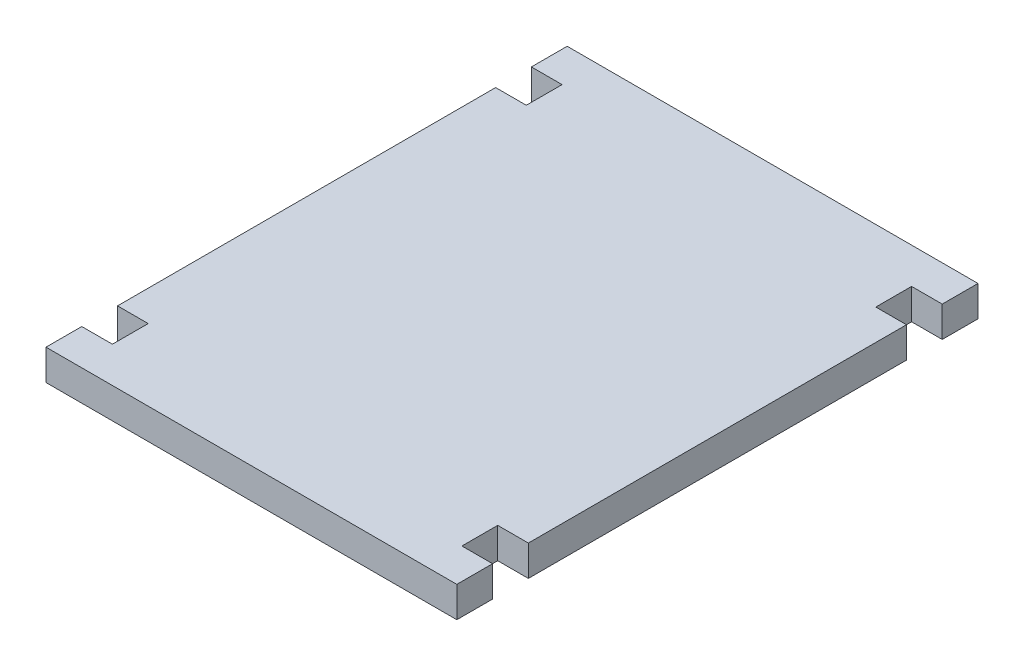
ISO-10303-21;
HEADER;
FILE_DESCRIPTION(('STEP AP214'),'2;1');
FILE_NAME('part.step','',(''),(''),'','','');
FILE_SCHEMA(('AUTOMOTIVE_DESIGN { 1 0 10303 214 1 1 1 1 }'));
ENDSEC;
DATA;
#1=APPLICATION_CONTEXT('core data for automotive mechanical design processes');
#2=APPLICATION_PROTOCOL_DEFINITION('international standard','automotive_design',2000,#1);
#3=PRODUCT_CONTEXT('',#1,'mechanical');
#4=PRODUCT('Part','Part','',(#3));
#5=PRODUCT_RELATED_PRODUCT_CATEGORY('part','',(#4));
#6=PRODUCT_DEFINITION_FORMATION('','',#4);
#7=PRODUCT_DEFINITION_CONTEXT('part definition',#1,'design');
#8=PRODUCT_DEFINITION('design','',#6,#7);
#9=PRODUCT_DEFINITION_SHAPE('','',#8);
#10=(LENGTH_UNIT() NAMED_UNIT(*) SI_UNIT(.MILLI.,.METRE.));
#11=(NAMED_UNIT(*) PLANE_ANGLE_UNIT() SI_UNIT($,.RADIAN.));
#12=(NAMED_UNIT(*) SI_UNIT($,.STERADIAN.) SOLID_ANGLE_UNIT());
#13=UNCERTAINTY_MEASURE_WITH_UNIT(LENGTH_MEASURE(1.E-05),#10,'distance_accuracy_value','');
#14=(GEOMETRIC_REPRESENTATION_CONTEXT(3) GLOBAL_UNCERTAINTY_ASSIGNED_CONTEXT((#13)) GLOBAL_UNIT_ASSIGNED_CONTEXT((#10,
#11,#12)) REPRESENTATION_CONTEXT('',''));
#15=CARTESIAN_POINT('',(0.,0.,0.));
#16=DIRECTION('',(0.,0.,1.));
#17=DIRECTION('',(1.,0.,0.));
#18=AXIS2_PLACEMENT_3D('',#15,#16,#17);
#19=CARTESIAN_POINT('',(33.5,5.,-42.5));
#20=DIRECTION('',(-1.,0.,0.));
#21=DIRECTION('',(0.,0.,1.));
#22=AXIS2_PLACEMENT_3D('',#19,#20,#21);
#23=PLANE('',#22);
#24=DIRECTION('',(0.,0.,-1.));
#25=VECTOR('',#24,1.);
#26=CARTESIAN_POINT('',(33.5,5.,-42.5));
#27=LINE('',#26,#25);
#28=CARTESIAN_POINT('',(33.5,5.,30.833334));
#29=VERTEX_POINT('',#28);
#30=CARTESIAN_POINT('',(33.5,5.,-30.833334));
#31=VERTEX_POINT('',#30);
#32=EDGE_CURVE('E287',#29,#31,#27,.T.);
#33=ORIENTED_EDGE('',*,*,#32,.F.);
#34=DIRECTION('',(0.,1.,0.));
#35=VECTOR('',#34,1.);
#36=CARTESIAN_POINT('',(33.5,0.,30.833334));
#37=LINE('',#36,#35);
#38=CARTESIAN_POINT('',(33.5,0.,30.833334));
#39=VERTEX_POINT('',#38);
#40=EDGE_CURVE('E198',#39,#29,#37,.T.);
#41=ORIENTED_EDGE('',*,*,#40,.F.);
#42=DIRECTION('',(0.,0.,-1.));
#43=VECTOR('',#42,1.);
#44=CARTESIAN_POINT('',(33.5,0.,-42.5));
#45=LINE('',#44,#43);
#46=CARTESIAN_POINT('',(33.5,0.,-30.833334));
#47=VERTEX_POINT('',#46);
#48=EDGE_CURVE('E302',#39,#47,#45,.T.);
#49=ORIENTED_EDGE('',*,*,#48,.T.);
#50=DIRECTION('',(0.,1.,0.));
#51=VECTOR('',#50,1.);
#52=CARTESIAN_POINT('',(33.5,0.,-30.833334));
#53=LINE('',#52,#51);
#54=EDGE_CURVE('E344',#47,#31,#53,.T.);
#55=ORIENTED_EDGE('',*,*,#54,.T.);
#56=EDGE_LOOP('',(#33,#41,#49,#55));
#57=FACE_BOUND('',#56,.T.);
#58=ADVANCED_FACE('F38',(#57),#23,.F.);
#59=CARTESIAN_POINT('',(33.5,5.,-36.666667));
#60=VERTEX_POINT('',#59);
#61=CARTESIAN_POINT('',(33.5,5.,-42.5));
#62=VERTEX_POINT('',#61);
#63=EDGE_CURVE('E288',#60,#62,#27,.T.);
#64=ORIENTED_EDGE('',*,*,#63,.F.);
#65=DIRECTION('',(0.,1.,0.));
#66=VECTOR('',#65,1.);
#67=CARTESIAN_POINT('',(33.5,0.,-36.666667));
#68=LINE('',#67,#66);
#69=CARTESIAN_POINT('',(33.5,0.,-36.666667));
#70=VERTEX_POINT('',#69);
#71=EDGE_CURVE('E185',#70,#60,#68,.T.);
#72=ORIENTED_EDGE('',*,*,#71,.F.);
#73=CARTESIAN_POINT('',(33.5,0.,-42.5));
#74=VERTEX_POINT('',#73);
#75=EDGE_CURVE('E276',#70,#74,#45,.T.);
#76=ORIENTED_EDGE('',*,*,#75,.T.);
#77=DIRECTION('',(0.,-1.,0.));
#78=VECTOR('',#77,1.);
#79=CARTESIAN_POINT('',(33.5,5.,-42.5));
#80=LINE('',#79,#78);
#81=EDGE_CURVE('E11',#62,#74,#80,.T.);
#82=ORIENTED_EDGE('',*,*,#81,.F.);
#83=EDGE_LOOP('',(#64,#72,#76,#82));
#84=FACE_BOUND('',#83,.T.);
#85=ADVANCED_FACE('F337',(#84),#23,.F.);
#86=CARTESIAN_POINT('',(-33.5,5.,-42.5));
#87=DIRECTION('',(1.,0.,0.));
#88=DIRECTION('',(0.,0.,-1.));
#89=AXIS2_PLACEMENT_3D('',#86,#87,#88);
#90=PLANE('',#89);
#91=DIRECTION('',(0.,0.,1.));
#92=VECTOR('',#91,1.);
#93=CARTESIAN_POINT('',(-33.5,5.,-42.5));
#94=LINE('',#93,#92);
#95=CARTESIAN_POINT('',(-33.5,5.,-30.833334));
#96=VERTEX_POINT('',#95);
#97=CARTESIAN_POINT('',(-33.5,5.,30.833334));
#98=VERTEX_POINT('',#97);
#99=EDGE_CURVE('E295',#96,#98,#94,.T.);
#100=ORIENTED_EDGE('',*,*,#99,.F.);
#101=DIRECTION('',(0.,1.,0.));
#102=VECTOR('',#101,1.);
#103=CARTESIAN_POINT('',(-33.5,0.,-30.833334));
#104=LINE('',#103,#102);
#105=CARTESIAN_POINT('',(-33.5,0.,-30.833334));
#106=VERTEX_POINT('',#105);
#107=EDGE_CURVE('E218',#106,#96,#104,.T.);
#108=ORIENTED_EDGE('',*,*,#107,.F.);
#109=DIRECTION('',(0.,0.,1.));
#110=VECTOR('',#109,1.);
#111=CARTESIAN_POINT('',(-33.5,0.,-42.5));
#112=LINE('',#111,#110);
#113=CARTESIAN_POINT('',(-33.5,0.,30.833334));
#114=VERTEX_POINT('',#113);
#115=EDGE_CURVE('E309',#106,#114,#112,.T.);
#116=ORIENTED_EDGE('',*,*,#115,.T.);
#117=DIRECTION('',(0.,1.,0.));
#118=VECTOR('',#117,1.);
#119=CARTESIAN_POINT('',(-33.5,0.,30.833334));
#120=LINE('',#119,#118);
#121=EDGE_CURVE('E279',#114,#98,#120,.T.);
#122=ORIENTED_EDGE('',*,*,#121,.T.);
#123=EDGE_LOOP('',(#100,#108,#116,#122));
#124=FACE_BOUND('',#123,.T.);
#125=ADVANCED_FACE('F367',(#124),#90,.F.);
#126=CARTESIAN_POINT('',(-33.5,5.,36.666667));
#127=VERTEX_POINT('',#126);
#128=CARTESIAN_POINT('',(-33.5,5.,42.5));
#129=VERTEX_POINT('',#128);
#130=EDGE_CURVE('E290',#127,#129,#94,.T.);
#131=ORIENTED_EDGE('',*,*,#130,.F.);
#132=DIRECTION('',(0.,1.,0.));
#133=VECTOR('',#132,1.);
#134=CARTESIAN_POINT('',(-33.5,0.,36.666667));
#135=LINE('',#134,#133);
#136=CARTESIAN_POINT('',(-33.5,0.,36.666667));
#137=VERTEX_POINT('',#136);
#138=EDGE_CURVE('E277',#137,#127,#135,.T.);
#139=ORIENTED_EDGE('',*,*,#138,.F.);
#140=CARTESIAN_POINT('',(-33.5,0.,42.5));
#141=VERTEX_POINT('',#140);
#142=EDGE_CURVE('E304',#137,#141,#112,.T.);
#143=ORIENTED_EDGE('',*,*,#142,.T.);
#144=DIRECTION('',(0.,-1.,0.));
#145=VECTOR('',#144,1.);
#146=CARTESIAN_POINT('',(-33.5,5.,42.5));
#147=LINE('',#146,#145);
#148=EDGE_CURVE('E313',#129,#141,#147,.T.);
#149=ORIENTED_EDGE('',*,*,#148,.F.);
#150=EDGE_LOOP('',(#131,#139,#143,#149));
#151=FACE_BOUND('',#150,.T.);
#152=ADVANCED_FACE('F369',(#151),#90,.F.);
#153=CARTESIAN_POINT('',(33.5,0.,42.5));
#154=VERTEX_POINT('',#153);
#155=CARTESIAN_POINT('',(33.5,0.,36.666667));
#156=VERTEX_POINT('',#155);
#157=EDGE_CURVE('E298',#154,#156,#45,.T.);
#158=ORIENTED_EDGE('',*,*,#157,.T.);
#159=DIRECTION('',(0.,1.,0.));
#160=VECTOR('',#159,1.);
#161=CARTESIAN_POINT('',(33.5,0.,36.666667));
#162=LINE('',#161,#160);
#163=CARTESIAN_POINT('',(33.5,5.,36.666667));
#164=VERTEX_POINT('',#163);
#165=EDGE_CURVE('E200',#156,#164,#162,.T.);
#166=ORIENTED_EDGE('',*,*,#165,.T.);
#167=CARTESIAN_POINT('',(33.5,5.,42.5));
#168=VERTEX_POINT('',#167);
#169=EDGE_CURVE('E283',#168,#164,#27,.T.);
#170=ORIENTED_EDGE('',*,*,#169,.F.);
#171=DIRECTION('',(0.,-1.,0.));
#172=VECTOR('',#171,1.);
#173=CARTESIAN_POINT('',(33.5,5.,42.5));
#174=LINE('',#173,#172);
#175=EDGE_CURVE('E297',#168,#154,#174,.T.);
#176=ORIENTED_EDGE('',*,*,#175,.T.);
#177=EDGE_LOOP('',(#158,#166,#170,#176));
#178=FACE_BOUND('',#177,.T.);
#179=ADVANCED_FACE('F40',(#178),#23,.F.);
#180=CARTESIAN_POINT('',(-33.5,5.,-42.5));
#181=DIRECTION('',(0.,0.,1.));
#182=DIRECTION('',(1.,0.,0.));
#183=AXIS2_PLACEMENT_3D('',#180,#181,#182);
#184=PLANE('',#183);
#185=DIRECTION('',(-1.,0.,0.));
#186=VECTOR('',#185,1.);
#187=CARTESIAN_POINT('',(-33.5,0.,-42.5));
#188=LINE('',#187,#186);
#189=CARTESIAN_POINT('',(-33.5,0.,-42.5));
#190=VERTEX_POINT('',#189);
#191=EDGE_CURVE('E301',#74,#190,#188,.T.);
#192=ORIENTED_EDGE('',*,*,#191,.T.);
#193=DIRECTION('',(0.,-1.,0.));
#194=VECTOR('',#193,1.);
#195=CARTESIAN_POINT('',(-33.5,5.,-42.5));
#196=LINE('',#195,#194);
#197=CARTESIAN_POINT('',(-33.5,5.,-42.5));
#198=VERTEX_POINT('',#197);
#199=EDGE_CURVE('E46',#198,#190,#196,.T.);
#200=ORIENTED_EDGE('',*,*,#199,.F.);
#201=DIRECTION('',(-1.,0.,0.));
#202=VECTOR('',#201,1.);
#203=CARTESIAN_POINT('',(-33.5,5.,-42.5));
#204=LINE('',#203,#202);
#205=EDGE_CURVE('E286',#62,#198,#204,.T.);
#206=ORIENTED_EDGE('',*,*,#205,.F.);
#207=ORIENTED_EDGE('',*,*,#81,.T.);
#208=EDGE_LOOP('',(#192,#200,#206,#207));
#209=FACE_BOUND('',#208,.T.);
#210=ADVANCED_FACE('F335',(#209),#184,.F.);
#211=CARTESIAN_POINT('',(-33.5,0.,-36.666667));
#212=VERTEX_POINT('',#211);
#213=EDGE_CURVE('E305',#190,#212,#112,.T.);
#214=ORIENTED_EDGE('',*,*,#213,.T.);
#215=DIRECTION('',(0.,1.,0.));
#216=VECTOR('',#215,1.);
#217=CARTESIAN_POINT('',(-33.5,0.,-36.666667));
#218=LINE('',#217,#216);
#219=CARTESIAN_POINT('',(-33.5,5.,-36.666667));
#220=VERTEX_POINT('',#219);
#221=EDGE_CURVE('E215',#212,#220,#218,.T.);
#222=ORIENTED_EDGE('',*,*,#221,.T.);
#223=EDGE_CURVE('E291',#198,#220,#94,.T.);
#224=ORIENTED_EDGE('',*,*,#223,.F.);
#225=ORIENTED_EDGE('',*,*,#199,.T.);
#226=EDGE_LOOP('',(#214,#222,#224,#225));
#227=FACE_BOUND('',#226,.T.);
#228=ADVANCED_FACE('F320',(#227),#90,.F.);
#229=CARTESIAN_POINT('',(-33.5,5.,42.5));
#230=DIRECTION('',(0.,0.,-1.));
#231=DIRECTION('',(-1.,0.,0.));
#232=AXIS2_PLACEMENT_3D('',#229,#230,#231);
#233=PLANE('',#232);
#234=DIRECTION('',(1.,0.,0.));
#235=VECTOR('',#234,1.);
#236=CARTESIAN_POINT('',(-33.5,0.,42.5));
#237=LINE('',#236,#235);
#238=EDGE_CURVE('E308',#141,#154,#237,.T.);
#239=ORIENTED_EDGE('',*,*,#238,.T.);
#240=ORIENTED_EDGE('',*,*,#175,.F.);
#241=DIRECTION('',(1.,0.,0.));
#242=VECTOR('',#241,1.);
#243=CARTESIAN_POINT('',(-33.5,5.,42.5));
#244=LINE('',#243,#242);
#245=EDGE_CURVE('E294',#129,#168,#244,.T.);
#246=ORIENTED_EDGE('',*,*,#245,.F.);
#247=ORIENTED_EDGE('',*,*,#148,.T.);
#248=EDGE_LOOP('',(#239,#240,#246,#247));
#249=FACE_BOUND('',#248,.T.);
#250=ADVANCED_FACE('F393',(#249),#233,.F.);
#251=CARTESIAN_POINT('',(0.,5.,0.));
#252=DIRECTION('',(0.,1.,0.));
#253=DIRECTION('',(0.,0.,1.));
#254=AXIS2_PLACEMENT_3D('',#251,#252,#253);
#255=PLANE('',#254);
#256=DIRECTION('',(1.,0.,0.));
#257=VECTOR('',#256,1.);
#258=CARTESIAN_POINT('',(-28.5,5.,-30.833334));
#259=LINE('',#258,#257);
#260=CARTESIAN_POINT('',(-28.5,5.,-30.833334));
#261=VERTEX_POINT('',#260);
#262=EDGE_CURVE('E227',#96,#261,#259,.T.);
#263=ORIENTED_EDGE('',*,*,#262,.F.);
#264=ORIENTED_EDGE('',*,*,#99,.T.);
#265=DIRECTION('',(-1.,0.,0.));
#266=VECTOR('',#265,1.);
#267=CARTESIAN_POINT('',(-28.5,5.,30.833334));
#268=LINE('',#267,#266);
#269=CARTESIAN_POINT('',(-28.5,5.,30.833334));
#270=VERTEX_POINT('',#269);
#271=EDGE_CURVE('E270',#270,#98,#268,.T.);
#272=ORIENTED_EDGE('',*,*,#271,.F.);
#273=DIRECTION('',(0.,0.,-1.));
#274=VECTOR('',#273,1.);
#275=CARTESIAN_POINT('',(-28.5,5.,30.833334));
#276=LINE('',#275,#274);
#277=CARTESIAN_POINT('',(-28.5,5.,36.666667));
#278=VERTEX_POINT('',#277);
#279=EDGE_CURVE('E230',#278,#270,#276,.T.);
#280=ORIENTED_EDGE('',*,*,#279,.F.);
#281=DIRECTION('',(1.,0.,0.));
#282=VECTOR('',#281,1.);
#283=CARTESIAN_POINT('',(-28.5,5.,36.666667));
#284=LINE('',#283,#282);
#285=EDGE_CURVE('E261',#127,#278,#284,.T.);
#286=ORIENTED_EDGE('',*,*,#285,.F.);
#287=ORIENTED_EDGE('',*,*,#130,.T.);
#288=ORIENTED_EDGE('',*,*,#245,.T.);
#289=ORIENTED_EDGE('',*,*,#169,.T.);
#290=DIRECTION('',(1.,0.,0.));
#291=VECTOR('',#290,1.);
#292=CARTESIAN_POINT('',(28.5,5.,36.666667));
#293=LINE('',#292,#291);
#294=CARTESIAN_POINT('',(28.5,5.,36.666667));
#295=VERTEX_POINT('',#294);
#296=EDGE_CURVE('E243',#295,#164,#293,.T.);
#297=ORIENTED_EDGE('',*,*,#296,.F.);
#298=DIRECTION('',(0.,0.,1.));
#299=VECTOR('',#298,1.);
#300=CARTESIAN_POINT('',(28.5,5.,30.833334));
#301=LINE('',#300,#299);
#302=CARTESIAN_POINT('',(28.5,5.,30.833334));
#303=VERTEX_POINT('',#302);
#304=EDGE_CURVE('E245',#303,#295,#301,.T.);
#305=ORIENTED_EDGE('',*,*,#304,.F.);
#306=DIRECTION('',(-1.,0.,0.));
#307=VECTOR('',#306,1.);
#308=CARTESIAN_POINT('',(28.5,5.,30.833334));
#309=LINE('',#308,#307);
#310=EDGE_CURVE('E220',#29,#303,#309,.T.);
#311=ORIENTED_EDGE('',*,*,#310,.F.);
#312=ORIENTED_EDGE('',*,*,#32,.T.);
#313=DIRECTION('',(1.,0.,0.));
#314=VECTOR('',#313,1.);
#315=CARTESIAN_POINT('',(28.5,5.,-30.833334));
#316=LINE('',#315,#314);
#317=CARTESIAN_POINT('',(28.5,5.,-30.833334));
#318=VERTEX_POINT('',#317);
#319=EDGE_CURVE('E193',#318,#31,#316,.T.);
#320=ORIENTED_EDGE('',*,*,#319,.F.);
#321=DIRECTION('',(0.,0.,1.));
#322=VECTOR('',#321,1.);
#323=CARTESIAN_POINT('',(28.5,5.,-30.833334));
#324=LINE('',#323,#322);
#325=CARTESIAN_POINT('',(28.5,5.,-36.666667));
#326=VERTEX_POINT('',#325);
#327=EDGE_CURVE('E179',#326,#318,#324,.T.);
#328=ORIENTED_EDGE('',*,*,#327,.F.);
#329=DIRECTION('',(-1.,0.,0.));
#330=VECTOR('',#329,1.);
#331=CARTESIAN_POINT('',(28.5,5.,-36.666667));
#332=LINE('',#331,#330);
#333=EDGE_CURVE('E188',#60,#326,#332,.T.);
#334=ORIENTED_EDGE('',*,*,#333,.F.);
#335=ORIENTED_EDGE('',*,*,#63,.T.);
#336=ORIENTED_EDGE('',*,*,#205,.T.);
#337=ORIENTED_EDGE('',*,*,#223,.T.);
#338=DIRECTION('',(-1.,0.,0.));
#339=VECTOR('',#338,1.);
#340=CARTESIAN_POINT('',(-28.5,5.,-36.666667));
#341=LINE('',#340,#339);
#342=CARTESIAN_POINT('',(-28.5,5.,-36.666667));
#343=VERTEX_POINT('',#342);
#344=EDGE_CURVE('E221',#343,#220,#341,.T.);
#345=ORIENTED_EDGE('',*,*,#344,.F.);
#346=DIRECTION('',(0.,0.,-1.));
#347=VECTOR('',#346,1.);
#348=CARTESIAN_POINT('',(-28.5,5.,-30.833334));
#349=LINE('',#348,#347);
#350=EDGE_CURVE('E223',#261,#343,#349,.T.);
#351=ORIENTED_EDGE('',*,*,#350,.F.);
#352=EDGE_LOOP('',(#263,#264,#272,#280,#286,#287,#288,#289,#297,#305,#311,#312,#320,#328,#334,
#335,#336,#337,#345,#351));
#353=FACE_BOUND('',#352,.T.);
#354=ADVANCED_FACE('F196',(#353),#255,.T.);
#355=CARTESIAN_POINT('',(0.,0.,0.));
#356=DIRECTION('',(0.,1.,0.));
#357=DIRECTION('',(0.,0.,1.));
#358=AXIS2_PLACEMENT_3D('',#355,#356,#357);
#359=PLANE('',#358);
#360=ORIENTED_EDGE('',*,*,#115,.F.);
#361=DIRECTION('',(1.,0.,0.));
#362=VECTOR('',#361,1.);
#363=CARTESIAN_POINT('',(-28.5,0.,-30.833334));
#364=LINE('',#363,#362);
#365=CARTESIAN_POINT('',(-28.5,0.,-30.833334));
#366=VERTEX_POINT('',#365);
#367=EDGE_CURVE('E224',#106,#366,#364,.T.);
#368=ORIENTED_EDGE('',*,*,#367,.T.);
#369=DIRECTION('',(0.,0.,-1.));
#370=VECTOR('',#369,1.);
#371=CARTESIAN_POINT('',(-28.5,0.,-30.833334));
#372=LINE('',#371,#370);
#373=CARTESIAN_POINT('',(-28.5,0.,-36.666667));
#374=VERTEX_POINT('',#373);
#375=EDGE_CURVE('E232',#366,#374,#372,.T.);
#376=ORIENTED_EDGE('',*,*,#375,.T.);
#377=DIRECTION('',(-1.,0.,0.));
#378=VECTOR('',#377,1.);
#379=CARTESIAN_POINT('',(-28.5,0.,-36.666667));
#380=LINE('',#379,#378);
#381=EDGE_CURVE('E53',#374,#212,#380,.T.);
#382=ORIENTED_EDGE('',*,*,#381,.T.);
#383=ORIENTED_EDGE('',*,*,#213,.F.);
#384=ORIENTED_EDGE('',*,*,#191,.F.);
#385=ORIENTED_EDGE('',*,*,#75,.F.);
#386=DIRECTION('',(-1.,0.,0.));
#387=VECTOR('',#386,1.);
#388=CARTESIAN_POINT('',(28.5,0.,-36.666667));
#389=LINE('',#388,#387);
#390=CARTESIAN_POINT('',(28.5,0.,-36.666667));
#391=VERTEX_POINT('',#390);
#392=EDGE_CURVE('E204',#70,#391,#389,.T.);
#393=ORIENTED_EDGE('',*,*,#392,.T.);
#394=DIRECTION('',(0.,0.,1.));
#395=VECTOR('',#394,1.);
#396=CARTESIAN_POINT('',(28.5,0.,-30.833334));
#397=LINE('',#396,#395);
#398=CARTESIAN_POINT('',(28.5,0.,-30.833334));
#399=VERTEX_POINT('',#398);
#400=EDGE_CURVE('E182',#391,#399,#397,.T.);
#401=ORIENTED_EDGE('',*,*,#400,.T.);
#402=DIRECTION('',(1.,0.,0.));
#403=VECTOR('',#402,1.);
#404=CARTESIAN_POINT('',(28.5,0.,-30.833334));
#405=LINE('',#404,#403);
#406=EDGE_CURVE('E206',#399,#47,#405,.T.);
#407=ORIENTED_EDGE('',*,*,#406,.T.);
#408=ORIENTED_EDGE('',*,*,#48,.F.);
#409=DIRECTION('',(-1.,0.,0.));
#410=VECTOR('',#409,1.);
#411=CARTESIAN_POINT('',(28.5,0.,30.833334));
#412=LINE('',#411,#410);
#413=CARTESIAN_POINT('',(28.5,0.,30.833334));
#414=VERTEX_POINT('',#413);
#415=EDGE_CURVE('E246',#39,#414,#412,.T.);
#416=ORIENTED_EDGE('',*,*,#415,.T.);
#417=DIRECTION('',(0.,0.,1.));
#418=VECTOR('',#417,1.);
#419=CARTESIAN_POINT('',(28.5,0.,30.833334));
#420=LINE('',#419,#418);
#421=CARTESIAN_POINT('',(28.5,0.,36.666667));
#422=VERTEX_POINT('',#421);
#423=EDGE_CURVE('E252',#414,#422,#420,.T.);
#424=ORIENTED_EDGE('',*,*,#423,.T.);
#425=DIRECTION('',(1.,0.,0.));
#426=VECTOR('',#425,1.);
#427=CARTESIAN_POINT('',(28.5,0.,36.666667));
#428=LINE('',#427,#426);
#429=EDGE_CURVE('E61',#422,#156,#428,.T.);
#430=ORIENTED_EDGE('',*,*,#429,.T.);
#431=ORIENTED_EDGE('',*,*,#157,.F.);
#432=ORIENTED_EDGE('',*,*,#238,.F.);
#433=ORIENTED_EDGE('',*,*,#142,.F.);
#434=DIRECTION('',(1.,0.,0.));
#435=VECTOR('',#434,1.);
#436=CARTESIAN_POINT('',(-28.5,0.,36.666667));
#437=LINE('',#436,#435);
#438=CARTESIAN_POINT('',(-28.5,0.,36.666667));
#439=VERTEX_POINT('',#438);
#440=EDGE_CURVE('E264',#137,#439,#437,.T.);
#441=ORIENTED_EDGE('',*,*,#440,.T.);
#442=DIRECTION('',(0.,0.,-1.));
#443=VECTOR('',#442,1.);
#444=CARTESIAN_POINT('',(-28.5,0.,30.833334));
#445=LINE('',#444,#443);
#446=CARTESIAN_POINT('',(-28.5,0.,30.833334));
#447=VERTEX_POINT('',#446);
#448=EDGE_CURVE('E257',#439,#447,#445,.T.);
#449=ORIENTED_EDGE('',*,*,#448,.T.);
#450=DIRECTION('',(-1.,0.,0.));
#451=VECTOR('',#450,1.);
#452=CARTESIAN_POINT('',(-28.5,0.,30.833334));
#453=LINE('',#452,#451);
#454=EDGE_CURVE('E260',#447,#114,#453,.T.);
#455=ORIENTED_EDGE('',*,*,#454,.T.);
#456=EDGE_LOOP('',(#360,#368,#376,#382,#383,#384,#385,#393,#401,#407,#408,#416,#424,#430,#431,
#432,#433,#441,#449,#455));
#457=FACE_BOUND('',#456,.T.);
#458=ADVANCED_FACE('F326',(#457),#359,.F.);
#459=CARTESIAN_POINT('',(-28.5,0.,30.833334));
#460=DIRECTION('',(1.,0.,0.));
#461=DIRECTION('',(0.,0.,-1.));
#462=AXIS2_PLACEMENT_3D('',#459,#460,#461);
#463=PLANE('',#462);
#464=ORIENTED_EDGE('',*,*,#279,.T.);
#465=DIRECTION('',(0.,1.,0.));
#466=VECTOR('',#465,1.);
#467=CARTESIAN_POINT('',(-28.5,0.,30.833334));
#468=LINE('',#467,#466);
#469=EDGE_CURVE('E267',#447,#270,#468,.T.);
#470=ORIENTED_EDGE('',*,*,#469,.F.);
#471=ORIENTED_EDGE('',*,*,#448,.F.);
#472=DIRECTION('',(0.,1.,0.));
#473=VECTOR('',#472,1.);
#474=CARTESIAN_POINT('',(-28.5,0.,36.666667));
#475=LINE('',#474,#473);
#476=EDGE_CURVE('E274',#439,#278,#475,.T.);
#477=ORIENTED_EDGE('',*,*,#476,.T.);
#478=EDGE_LOOP('',(#464,#470,#471,#477));
#479=FACE_BOUND('',#478,.T.);
#480=ADVANCED_FACE('F424',(#479),#463,.F.);
#481=CARTESIAN_POINT('',(-28.5,0.,36.666667));
#482=DIRECTION('',(0.,0.,1.));
#483=DIRECTION('',(1.,0.,0.));
#484=AXIS2_PLACEMENT_3D('',#481,#482,#483);
#485=PLANE('',#484);
#486=ORIENTED_EDGE('',*,*,#285,.T.);
#487=ORIENTED_EDGE('',*,*,#476,.F.);
#488=ORIENTED_EDGE('',*,*,#440,.F.);
#489=ORIENTED_EDGE('',*,*,#138,.T.);
#490=EDGE_LOOP('',(#486,#487,#488,#489));
#491=FACE_BOUND('',#490,.T.);
#492=ADVANCED_FACE('F421',(#491),#485,.F.);
#493=CARTESIAN_POINT('',(-28.5,0.,30.833334));
#494=DIRECTION('',(0.,0.,-1.));
#495=DIRECTION('',(-1.,0.,0.));
#496=AXIS2_PLACEMENT_3D('',#493,#494,#495);
#497=PLANE('',#496);
#498=ORIENTED_EDGE('',*,*,#271,.T.);
#499=ORIENTED_EDGE('',*,*,#121,.F.);
#500=ORIENTED_EDGE('',*,*,#454,.F.);
#501=ORIENTED_EDGE('',*,*,#469,.T.);
#502=EDGE_LOOP('',(#498,#499,#500,#501));
#503=FACE_BOUND('',#502,.T.);
#504=ADVANCED_FACE('F403',(#503),#497,.F.);
#505=CARTESIAN_POINT('',(28.5,0.,-30.833334));
#506=DIRECTION('',(-1.,0.,0.));
#507=DIRECTION('',(0.,0.,1.));
#508=AXIS2_PLACEMENT_3D('',#505,#506,#507);
#509=PLANE('',#508);
#510=ORIENTED_EDGE('',*,*,#327,.T.);
#511=DIRECTION('',(0.,1.,0.));
#512=VECTOR('',#511,1.);
#513=CARTESIAN_POINT('',(28.5,0.,-30.833334));
#514=LINE('',#513,#512);
#515=EDGE_CURVE('E207',#399,#318,#514,.T.);
#516=ORIENTED_EDGE('',*,*,#515,.F.);
#517=ORIENTED_EDGE('',*,*,#400,.F.);
#518=DIRECTION('',(0.,1.,0.));
#519=VECTOR('',#518,1.);
#520=CARTESIAN_POINT('',(28.5,0.,-36.666667));
#521=LINE('',#520,#519);
#522=EDGE_CURVE('E175',#391,#326,#521,.T.);
#523=ORIENTED_EDGE('',*,*,#522,.T.);
#524=EDGE_LOOP('',(#510,#516,#517,#523));
#525=FACE_BOUND('',#524,.T.);
#526=ADVANCED_FACE('F177',(#525),#509,.F.);
#527=CARTESIAN_POINT('',(28.5,0.,-36.666667));
#528=DIRECTION('',(0.,0.,-1.));
#529=DIRECTION('',(-1.,0.,0.));
#530=AXIS2_PLACEMENT_3D('',#527,#528,#529);
#531=PLANE('',#530);
#532=ORIENTED_EDGE('',*,*,#333,.T.);
#533=ORIENTED_EDGE('',*,*,#522,.F.);
#534=ORIENTED_EDGE('',*,*,#392,.F.);
#535=ORIENTED_EDGE('',*,*,#71,.T.);
#536=EDGE_LOOP('',(#532,#533,#534,#535));
#537=FACE_BOUND('',#536,.T.);
#538=ADVANCED_FACE('F189',(#537),#531,.F.);
#539=CARTESIAN_POINT('',(28.5,0.,-30.833334));
#540=DIRECTION('',(0.,0.,1.));
#541=DIRECTION('',(1.,0.,0.));
#542=AXIS2_PLACEMENT_3D('',#539,#540,#541);
#543=PLANE('',#542);
#544=ORIENTED_EDGE('',*,*,#319,.T.);
#545=ORIENTED_EDGE('',*,*,#54,.F.);
#546=ORIENTED_EDGE('',*,*,#406,.F.);
#547=ORIENTED_EDGE('',*,*,#515,.T.);
#548=EDGE_LOOP('',(#544,#545,#546,#547));
#549=FACE_BOUND('',#548,.T.);
#550=ADVANCED_FACE('F347',(#549),#543,.F.);
#551=CARTESIAN_POINT('',(28.5,0.,30.833334));
#552=DIRECTION('',(0.,0.,-1.));
#553=DIRECTION('',(-1.,0.,0.));
#554=AXIS2_PLACEMENT_3D('',#551,#552,#553);
#555=PLANE('',#554);
#556=ORIENTED_EDGE('',*,*,#310,.T.);
#557=DIRECTION('',(0.,1.,0.));
#558=VECTOR('',#557,1.);
#559=CARTESIAN_POINT('',(28.5,0.,30.833334));
#560=LINE('',#559,#558);
#561=EDGE_CURVE('E237',#414,#303,#560,.T.);
#562=ORIENTED_EDGE('',*,*,#561,.F.);
#563=ORIENTED_EDGE('',*,*,#415,.F.);
#564=ORIENTED_EDGE('',*,*,#40,.T.);
#565=EDGE_LOOP('',(#556,#562,#563,#564));
#566=FACE_BOUND('',#565,.T.);
#567=ADVANCED_FACE('F352',(#566),#555,.F.);
#568=CARTESIAN_POINT('',(28.5,0.,36.666667));
#569=DIRECTION('',(0.,0.,1.));
#570=DIRECTION('',(1.,0.,0.));
#571=AXIS2_PLACEMENT_3D('',#568,#569,#570);
#572=PLANE('',#571);
#573=ORIENTED_EDGE('',*,*,#296,.T.);
#574=ORIENTED_EDGE('',*,*,#165,.F.);
#575=ORIENTED_EDGE('',*,*,#429,.F.);
#576=DIRECTION('',(0.,1.,0.));
#577=VECTOR('',#576,1.);
#578=CARTESIAN_POINT('',(28.5,0.,36.666667));
#579=LINE('',#578,#577);
#580=EDGE_CURVE('E239',#422,#295,#579,.T.);
#581=ORIENTED_EDGE('',*,*,#580,.T.);
#582=EDGE_LOOP('',(#573,#574,#575,#581));
#583=FACE_BOUND('',#582,.T.);
#584=ADVANCED_FACE('F358',(#583),#572,.F.);
#585=CARTESIAN_POINT('',(28.5,0.,30.833334));
#586=DIRECTION('',(-1.,0.,0.));
#587=DIRECTION('',(0.,0.,1.));
#588=AXIS2_PLACEMENT_3D('',#585,#586,#587);
#589=PLANE('',#588);
#590=ORIENTED_EDGE('',*,*,#304,.T.);
#591=ORIENTED_EDGE('',*,*,#580,.F.);
#592=ORIENTED_EDGE('',*,*,#423,.F.);
#593=ORIENTED_EDGE('',*,*,#561,.T.);
#594=EDGE_LOOP('',(#590,#591,#592,#593));
#595=FACE_BOUND('',#594,.T.);
#596=ADVANCED_FACE('F384',(#595),#589,.F.);
#597=CARTESIAN_POINT('',(-28.5,0.,-30.833334));
#598=DIRECTION('',(0.,0.,1.));
#599=DIRECTION('',(1.,0.,0.));
#600=AXIS2_PLACEMENT_3D('',#597,#598,#599);
#601=PLANE('',#600);
#602=ORIENTED_EDGE('',*,*,#262,.T.);
#603=DIRECTION('',(0.,1.,0.));
#604=VECTOR('',#603,1.);
#605=CARTESIAN_POINT('',(-28.5,0.,-30.833334));
#606=LINE('',#605,#604);
#607=EDGE_CURVE('E211',#366,#261,#606,.T.);
#608=ORIENTED_EDGE('',*,*,#607,.F.);
#609=ORIENTED_EDGE('',*,*,#367,.F.);
#610=ORIENTED_EDGE('',*,*,#107,.T.);
#611=EDGE_LOOP('',(#602,#608,#609,#610));
#612=FACE_BOUND('',#611,.T.);
#613=ADVANCED_FACE('F407',(#612),#601,.F.);
#614=CARTESIAN_POINT('',(-28.5,0.,-36.666667));
#615=DIRECTION('',(0.,0.,-1.));
#616=DIRECTION('',(-1.,0.,0.));
#617=AXIS2_PLACEMENT_3D('',#614,#615,#616);
#618=PLANE('',#617);
#619=ORIENTED_EDGE('',*,*,#344,.T.);
#620=ORIENTED_EDGE('',*,*,#221,.F.);
#621=ORIENTED_EDGE('',*,*,#381,.F.);
#622=DIRECTION('',(0.,1.,0.));
#623=VECTOR('',#622,1.);
#624=CARTESIAN_POINT('',(-28.5,0.,-36.666667));
#625=LINE('',#624,#623);
#626=EDGE_CURVE('E213',#374,#343,#625,.T.);
#627=ORIENTED_EDGE('',*,*,#626,.T.);
#628=EDGE_LOOP('',(#619,#620,#621,#627));
#629=FACE_BOUND('',#628,.T.);
#630=ADVANCED_FACE('F333',(#629),#618,.F.);
#631=CARTESIAN_POINT('',(-28.5,0.,-30.833334));
#632=DIRECTION('',(1.,0.,0.));
#633=DIRECTION('',(0.,0.,-1.));
#634=AXIS2_PLACEMENT_3D('',#631,#632,#633);
#635=PLANE('',#634);
#636=ORIENTED_EDGE('',*,*,#350,.T.);
#637=ORIENTED_EDGE('',*,*,#626,.F.);
#638=ORIENTED_EDGE('',*,*,#375,.F.);
#639=ORIENTED_EDGE('',*,*,#607,.T.);
#640=EDGE_LOOP('',(#636,#637,#638,#639));
#641=FACE_BOUND('',#640,.T.);
#642=ADVANCED_FACE('F330',(#641),#635,.F.);
#643=CLOSED_SHELL('',(#58,#85,#125,#152,#179,#210,#228,#250,#354,#458,#480,#492,#504,#526,#538,
#550,#567,#584,#596,#613,#630,#642));
#644=MANIFOLD_SOLID_BREP('B2',#643);
#645=ADVANCED_BREP_SHAPE_REPRESENTATION('',(#18,#644),#14);
#646=SHAPE_DEFINITION_REPRESENTATION(#9,#645);
ENDSEC;
END-ISO-10303-21;
